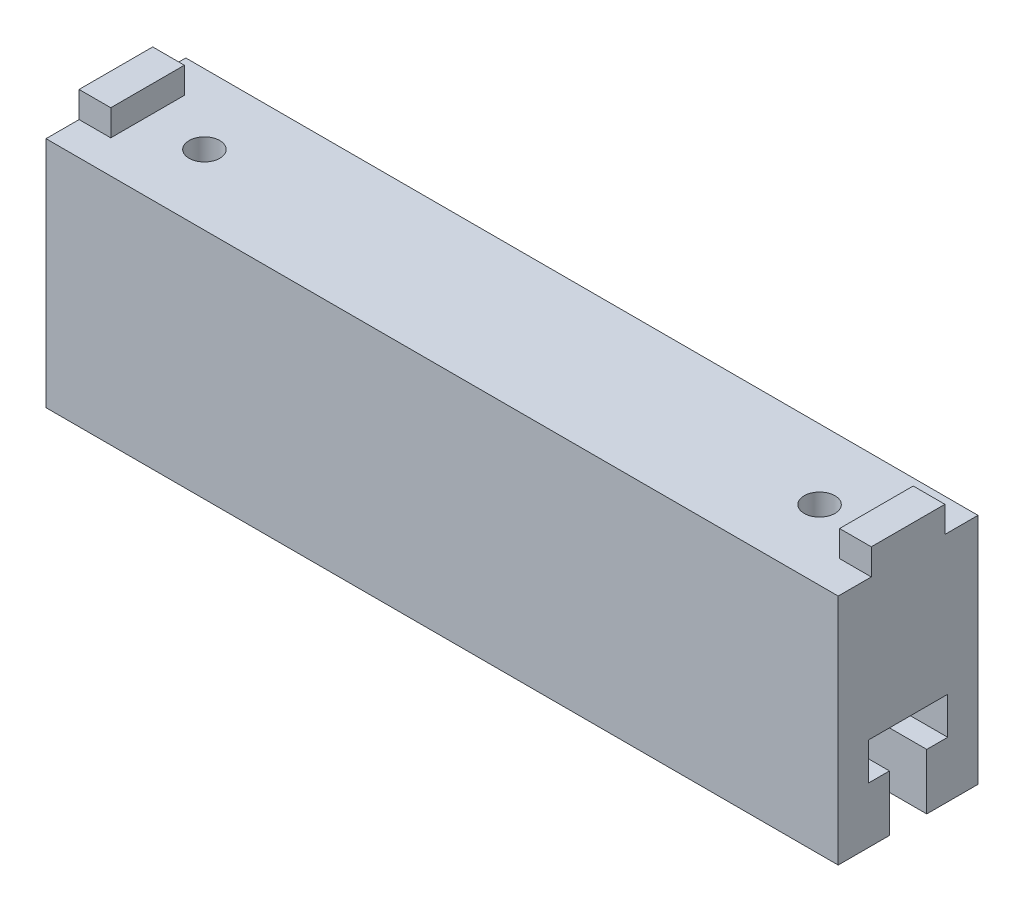
ISO-10303-21;
HEADER;
FILE_DESCRIPTION(('STEP AP214'),'2;1');
FILE_NAME('part.step','',(''),(''),'','','');
FILE_SCHEMA(('AUTOMOTIVE_DESIGN { 1 0 10303 214 1 1 1 1 }'));
ENDSEC;
DATA;
#1=APPLICATION_CONTEXT('core data for automotive mechanical design processes');
#2=APPLICATION_PROTOCOL_DEFINITION('international standard','automotive_design',2000,#1);
#3=PRODUCT_CONTEXT('',#1,'mechanical');
#4=PRODUCT('Part','Part','',(#3));
#5=PRODUCT_RELATED_PRODUCT_CATEGORY('part','',(#4));
#6=PRODUCT_DEFINITION_FORMATION('','',#4);
#7=PRODUCT_DEFINITION_CONTEXT('part definition',#1,'design');
#8=PRODUCT_DEFINITION('design','',#6,#7);
#9=PRODUCT_DEFINITION_SHAPE('','',#8);
#10=(LENGTH_UNIT() NAMED_UNIT(*) SI_UNIT(.MILLI.,.METRE.));
#11=(NAMED_UNIT(*) PLANE_ANGLE_UNIT() SI_UNIT($,.RADIAN.));
#12=(NAMED_UNIT(*) SI_UNIT($,.STERADIAN.) SOLID_ANGLE_UNIT());
#13=UNCERTAINTY_MEASURE_WITH_UNIT(LENGTH_MEASURE(1.E-05),#10,'distance_accuracy_value','');
#14=(GEOMETRIC_REPRESENTATION_CONTEXT(3) GLOBAL_UNCERTAINTY_ASSIGNED_CONTEXT((#13)) GLOBAL_UNIT_ASSIGNED_CONTEXT((#10,
#11,#12)) REPRESENTATION_CONTEXT('',''));
#15=CARTESIAN_POINT('',(0.,0.,0.));
#16=DIRECTION('',(0.,0.,1.));
#17=DIRECTION('',(1.,0.,0.));
#18=AXIS2_PLACEMENT_3D('',#15,#16,#17);
#19=CARTESIAN_POINT('',(0.,0.,0.));
#20=DIRECTION('',(0.,-1.,0.));
#21=DIRECTION('',(0.,0.,-1.));
#22=AXIS2_PLACEMENT_3D('',#19,#20,#21);
#23=PLANE('',#22);
#24=DIRECTION('',(1.,0.,0.));
#25=VECTOR('',#24,1.);
#26=CARTESIAN_POINT('',(-42.5,0.,2.));
#27=LINE('',#26,#25);
#28=CARTESIAN_POINT('',(-42.5,0.,2.));
#29=VERTEX_POINT('',#28);
#30=CARTESIAN_POINT('',(42.5,0.,2.));
#31=VERTEX_POINT('',#30);
#32=EDGE_CURVE('E178',#29,#31,#27,.T.);
#33=ORIENTED_EDGE('',*,*,#32,.T.);
#34=DIRECTION('',(0.,0.,-1.));
#35=VECTOR('',#34,1.);
#36=CARTESIAN_POINT('',(42.5,0.,7.5));
#37=LINE('',#36,#35);
#38=CARTESIAN_POINT('',(42.5,0.,7.5));
#39=VERTEX_POINT('',#38);
#40=EDGE_CURVE('E213',#39,#31,#37,.T.);
#41=ORIENTED_EDGE('',*,*,#40,.F.);
#42=DIRECTION('',(1.,0.,0.));
#43=VECTOR('',#42,1.);
#44=CARTESIAN_POINT('',(-42.5,0.,7.5));
#45=LINE('',#44,#43);
#46=CARTESIAN_POINT('',(-42.5,0.,7.5));
#47=VERTEX_POINT('',#46);
#48=EDGE_CURVE('E205',#47,#39,#45,.T.);
#49=ORIENTED_EDGE('',*,*,#48,.F.);
#50=DIRECTION('',(0.,0.,1.));
#51=VECTOR('',#50,1.);
#52=CARTESIAN_POINT('',(-42.5,0.,7.5));
#53=LINE('',#52,#51);
#54=EDGE_CURVE('E197',#29,#47,#53,.T.);
#55=ORIENTED_EDGE('',*,*,#54,.F.);
#56=EDGE_LOOP('',(#33,#41,#49,#55));
#57=FACE_BOUND('',#56,.T.);
#58=ADVANCED_FACE('F39',(#57),#23,.T.);
#59=CARTESIAN_POINT('',(0.,25.,0.));
#60=DIRECTION('',(0.,-1.,0.));
#61=DIRECTION('',(0.,0.,-1.));
#62=AXIS2_PLACEMENT_3D('',#59,#60,#61);
#63=PLANE('',#62);
#64=CARTESIAN_POINT('',(33.,25.,0.));
#65=DIRECTION('',(0.,1.,0.));
#66=DIRECTION('',(0.,0.,1.));
#67=AXIS2_PLACEMENT_3D('',#64,#65,#66);
#68=CIRCLE('',#67,1.651);
#69=CARTESIAN_POINT('',(33.,25.,1.651));
#70=VERTEX_POINT('',#69);
#71=EDGE_CURVE('E665',#70,#70,#68,.T.);
#72=ORIENTED_EDGE('',*,*,#71,.F.);
#73=EDGE_LOOP('',(#72));
#74=FACE_BOUND('',#73,.T.);
#75=CARTESIAN_POINT('',(-33.,25.,0.));
#76=DIRECTION('',(0.,1.,0.));
#77=DIRECTION('',(0.,0.,-1.));
#78=AXIS2_PLACEMENT_3D('',#75,#76,#77);
#79=CIRCLE('',#78,1.651);
#80=CARTESIAN_POINT('',(-33.,25.,1.651));
#81=VERTEX_POINT('',#80);
#82=EDGE_CURVE('E674',#81,#81,#79,.T.);
#83=ORIENTED_EDGE('',*,*,#82,.F.);
#84=EDGE_LOOP('',(#83));
#85=FACE_BOUND('',#84,.T.);
#86=DIRECTION('',(-1.,0.,0.));
#87=VECTOR('',#86,1.);
#88=CARTESIAN_POINT('',(42.5,25.,-3.95));
#89=LINE('',#88,#87);
#90=CARTESIAN_POINT('',(42.5,25.,-3.95));
#91=VERTEX_POINT('',#90);
#92=CARTESIAN_POINT('',(39.1,25.,-3.95000000000002));
#93=VERTEX_POINT('',#92);
#94=EDGE_CURVE('E277',#91,#93,#89,.T.);
#95=ORIENTED_EDGE('',*,*,#94,.F.);
#96=DIRECTION('',(0.,0.,-1.));
#97=VECTOR('',#96,1.);
#98=CARTESIAN_POINT('',(42.5,25.,7.5));
#99=LINE('',#98,#97);
#100=CARTESIAN_POINT('',(42.5,25.,-7.5));
#101=VERTEX_POINT('',#100);
#102=EDGE_CURVE('E219',#91,#101,#99,.T.);
#103=ORIENTED_EDGE('',*,*,#102,.T.);
#104=DIRECTION('',(-1.,0.,0.));
#105=VECTOR('',#104,1.);
#106=CARTESIAN_POINT('',(-42.5,25.,-7.5));
#107=LINE('',#106,#105);
#108=CARTESIAN_POINT('',(-42.5,25.,-7.5));
#109=VERTEX_POINT('',#108);
#110=EDGE_CURVE('E358',#101,#109,#107,.T.);
#111=ORIENTED_EDGE('',*,*,#110,.T.);
#112=DIRECTION('',(0.,0.,1.));
#113=VECTOR('',#112,1.);
#114=CARTESIAN_POINT('',(-42.5,25.,7.5));
#115=LINE('',#114,#113);
#116=CARTESIAN_POINT('',(-42.5,25.,-3.95));
#117=VERTEX_POINT('',#116);
#118=EDGE_CURVE('E233',#109,#117,#115,.T.);
#119=ORIENTED_EDGE('',*,*,#118,.T.);
#120=DIRECTION('',(-1.,0.,0.));
#121=VECTOR('',#120,1.);
#122=CARTESIAN_POINT('',(-42.5,25.,-3.95));
#123=LINE('',#122,#121);
#124=CARTESIAN_POINT('',(-39.1,25.,-3.95));
#125=VERTEX_POINT('',#124);
#126=EDGE_CURVE('E321',#125,#117,#123,.T.);
#127=ORIENTED_EDGE('',*,*,#126,.F.);
#128=DIRECTION('',(0.,0.,-1.));
#129=VECTOR('',#128,1.);
#130=CARTESIAN_POINT('',(-39.1,25.,3.95));
#131=LINE('',#130,#129);
#132=CARTESIAN_POINT('',(-39.1,25.,3.95));
#133=VERTEX_POINT('',#132);
#134=EDGE_CURVE('E334',#133,#125,#131,.T.);
#135=ORIENTED_EDGE('',*,*,#134,.F.);
#136=DIRECTION('',(1.,0.,0.));
#137=VECTOR('',#136,1.);
#138=CARTESIAN_POINT('',(-42.5,25.,3.95));
#139=LINE('',#138,#137);
#140=CARTESIAN_POINT('',(-42.5,25.,3.95));
#141=VERTEX_POINT('',#140);
#142=EDGE_CURVE('E315',#141,#133,#139,.T.);
#143=ORIENTED_EDGE('',*,*,#142,.F.);
#144=CARTESIAN_POINT('',(-42.5,25.,7.5));
#145=VERTEX_POINT('',#144);
#146=EDGE_CURVE('E361',#141,#145,#115,.T.);
#147=ORIENTED_EDGE('',*,*,#146,.T.);
#148=DIRECTION('',(1.,0.,0.));
#149=VECTOR('',#148,1.);
#150=CARTESIAN_POINT('',(-42.5,25.,7.5));
#151=LINE('',#150,#149);
#152=CARTESIAN_POINT('',(42.5,25.,7.5));
#153=VERTEX_POINT('',#152);
#154=EDGE_CURVE('E225',#145,#153,#151,.T.);
#155=ORIENTED_EDGE('',*,*,#154,.T.);
#156=CARTESIAN_POINT('',(42.5,25.,3.95));
#157=VERTEX_POINT('',#156);
#158=EDGE_CURVE('E355',#153,#157,#99,.T.);
#159=ORIENTED_EDGE('',*,*,#158,.T.);
#160=DIRECTION('',(1.,0.,0.));
#161=VECTOR('',#160,1.);
#162=CARTESIAN_POINT('',(42.5,25.,3.95));
#163=LINE('',#162,#161);
#164=CARTESIAN_POINT('',(39.1,25.,3.95));
#165=VERTEX_POINT('',#164);
#166=EDGE_CURVE('E283',#165,#157,#163,.T.);
#167=ORIENTED_EDGE('',*,*,#166,.F.);
#168=DIRECTION('',(0.,0.,1.));
#169=VECTOR('',#168,1.);
#170=CARTESIAN_POINT('',(39.1,25.,3.95));
#171=LINE('',#170,#169);
#172=EDGE_CURVE('E63',#93,#165,#171,.T.);
#173=ORIENTED_EDGE('',*,*,#172,.F.);
#174=EDGE_LOOP('',(#95,#103,#111,#119,#127,#135,#143,#147,#155,#159,#167,#173));
#175=FACE_BOUND('',#174,.T.);
#176=ADVANCED_FACE('F433',(#74,#85,#175),#63,.F.);
#177=CARTESIAN_POINT('',(42.5,25.,7.5));
#178=DIRECTION('',(-1.,0.,0.));
#179=DIRECTION('',(0.,0.,1.));
#180=AXIS2_PLACEMENT_3D('',#177,#178,#179);
#181=PLANE('',#180);
#182=ORIENTED_EDGE('',*,*,#40,.T.);
#183=DIRECTION('',(0.,1.,0.));
#184=VECTOR('',#183,1.);
#185=CARTESIAN_POINT('',(42.5,25.,2.00000000000001));
#186=LINE('',#185,#184);
#187=CARTESIAN_POINT('',(42.5,6.,2.));
#188=VERTEX_POINT('',#187);
#189=EDGE_CURVE('E185',#31,#188,#186,.T.);
#190=ORIENTED_EDGE('',*,*,#189,.T.);
#191=DIRECTION('',(0.,0.,1.));
#192=VECTOR('',#191,1.);
#193=CARTESIAN_POINT('',(42.5,6.,7.50000000000001));
#194=LINE('',#193,#192);
#195=CARTESIAN_POINT('',(42.5,6.,4.25));
#196=VERTEX_POINT('',#195);
#197=EDGE_CURVE('E273',#188,#196,#194,.T.);
#198=ORIENTED_EDGE('',*,*,#197,.T.);
#199=DIRECTION('',(0.,1.,0.));
#200=VECTOR('',#199,1.);
#201=CARTESIAN_POINT('',(42.5,25.,4.25));
#202=LINE('',#201,#200);
#203=CARTESIAN_POINT('',(42.5,10.,4.25));
#204=VERTEX_POINT('',#203);
#205=EDGE_CURVE('E269',#196,#204,#202,.T.);
#206=ORIENTED_EDGE('',*,*,#205,.T.);
#207=DIRECTION('',(0.,0.,-1.));
#208=VECTOR('',#207,1.);
#209=CARTESIAN_POINT('',(42.5,10.,7.5));
#210=LINE('',#209,#208);
#211=CARTESIAN_POINT('',(42.5,10.,-4.25));
#212=VERTEX_POINT('',#211);
#213=EDGE_CURVE('E265',#204,#212,#210,.T.);
#214=ORIENTED_EDGE('',*,*,#213,.T.);
#215=DIRECTION('',(0.,-1.,0.));
#216=VECTOR('',#215,1.);
#217=CARTESIAN_POINT('',(42.5,25.,-4.24999999999999));
#218=LINE('',#217,#216);
#219=CARTESIAN_POINT('',(42.5,6.,-4.25));
#220=VERTEX_POINT('',#219);
#221=EDGE_CURVE('E261',#212,#220,#218,.T.);
#222=ORIENTED_EDGE('',*,*,#221,.T.);
#223=DIRECTION('',(0.,0.,1.));
#224=VECTOR('',#223,1.);
#225=CARTESIAN_POINT('',(42.5,5.99999999999999,7.49999999999999));
#226=LINE('',#225,#224);
#227=CARTESIAN_POINT('',(42.5,6.,-2.));
#228=VERTEX_POINT('',#227);
#229=EDGE_CURVE('E257',#220,#228,#226,.T.);
#230=ORIENTED_EDGE('',*,*,#229,.T.);
#231=DIRECTION('',(0.,-1.,0.));
#232=VECTOR('',#231,1.);
#233=CARTESIAN_POINT('',(42.5,25.,-2.));
#234=LINE('',#233,#232);
#235=CARTESIAN_POINT('',(42.5,0.,-2.));
#236=VERTEX_POINT('',#235);
#237=EDGE_CURVE('E251',#228,#236,#234,.T.);
#238=ORIENTED_EDGE('',*,*,#237,.T.);
#239=CARTESIAN_POINT('',(42.5,0.,-7.5));
#240=VERTEX_POINT('',#239);
#241=EDGE_CURVE('E240',#236,#240,#37,.T.);
#242=ORIENTED_EDGE('',*,*,#241,.T.);
#243=DIRECTION('',(0.,-1.,0.));
#244=VECTOR('',#243,1.);
#245=CARTESIAN_POINT('',(42.5,25.,-7.5));
#246=LINE('',#245,#244);
#247=EDGE_CURVE('E11',#101,#240,#246,.T.);
#248=ORIENTED_EDGE('',*,*,#247,.F.);
#249=ORIENTED_EDGE('',*,*,#102,.F.);
#250=DIRECTION('',(0.,-1.,0.));
#251=VECTOR('',#250,1.);
#252=CARTESIAN_POINT('',(42.5,27.8,-3.95));
#253=LINE('',#252,#251);
#254=CARTESIAN_POINT('',(42.5,27.8,-3.95));
#255=VERTEX_POINT('',#254);
#256=EDGE_CURVE('E311',#255,#91,#253,.T.);
#257=ORIENTED_EDGE('',*,*,#256,.F.);
#258=DIRECTION('',(0.,0.,-1.));
#259=VECTOR('',#258,1.);
#260=CARTESIAN_POINT('',(42.5,27.8,3.95));
#261=LINE('',#260,#259);
#262=CARTESIAN_POINT('',(42.5,27.8,3.95));
#263=VERTEX_POINT('',#262);
#264=EDGE_CURVE('E278',#263,#255,#261,.T.);
#265=ORIENTED_EDGE('',*,*,#264,.F.);
#266=DIRECTION('',(0.,-1.,0.));
#267=VECTOR('',#266,1.);
#268=CARTESIAN_POINT('',(42.5,27.8,3.95));
#269=LINE('',#268,#267);
#270=EDGE_CURVE('E292',#263,#157,#269,.T.);
#271=ORIENTED_EDGE('',*,*,#270,.T.);
#272=ORIENTED_EDGE('',*,*,#158,.F.);
#273=DIRECTION('',(0.,-1.,0.));
#274=VECTOR('',#273,1.);
#275=CARTESIAN_POINT('',(42.5,25.,7.5));
#276=LINE('',#275,#274);
#277=EDGE_CURVE('E220',#153,#39,#276,.T.);
#278=ORIENTED_EDGE('',*,*,#277,.T.);
#279=EDGE_LOOP('',(#182,#190,#198,#206,#214,#222,#230,#238,#242,#248,#249,#257,#265,#271,#272,#278));
#280=FACE_BOUND('',#279,.T.);
#281=ADVANCED_FACE('F41',(#280),#181,.F.);
#282=CARTESIAN_POINT('',(-42.5,25.,-7.5));
#283=DIRECTION('',(0.,0.,1.));
#284=DIRECTION('',(1.,0.,0.));
#285=AXIS2_PLACEMENT_3D('',#282,#283,#284);
#286=PLANE('',#285);
#287=DIRECTION('',(-1.,0.,0.));
#288=VECTOR('',#287,1.);
#289=CARTESIAN_POINT('',(-42.5,0.,-7.5));
#290=LINE('',#289,#288);
#291=CARTESIAN_POINT('',(-42.5,0.,-7.5));
#292=VERTEX_POINT('',#291);
#293=EDGE_CURVE('E208',#240,#292,#290,.T.);
#294=ORIENTED_EDGE('',*,*,#293,.T.);
#295=DIRECTION('',(0.,-1.,0.));
#296=VECTOR('',#295,1.);
#297=CARTESIAN_POINT('',(-42.5,25.,-7.5));
#298=LINE('',#297,#296);
#299=EDGE_CURVE('E48',#109,#292,#298,.T.);
#300=ORIENTED_EDGE('',*,*,#299,.F.);
#301=ORIENTED_EDGE('',*,*,#110,.F.);
#302=ORIENTED_EDGE('',*,*,#247,.T.);
#303=EDGE_LOOP('',(#294,#300,#301,#302));
#304=FACE_BOUND('',#303,.T.);
#305=ADVANCED_FACE('F455',(#304),#286,.F.);
#306=CARTESIAN_POINT('',(-42.5,25.,7.5));
#307=DIRECTION('',(1.,0.,0.));
#308=DIRECTION('',(0.,0.,-1.));
#309=AXIS2_PLACEMENT_3D('',#306,#307,#308);
#310=PLANE('',#309);
#311=DIRECTION('',(0.,0.,-1.));
#312=VECTOR('',#311,1.);
#313=CARTESIAN_POINT('',(-42.5,6.,4.25));
#314=LINE('',#313,#312);
#315=CARTESIAN_POINT('',(-42.5,6.,4.25));
#316=VERTEX_POINT('',#315);
#317=CARTESIAN_POINT('',(-42.5,6.,2.));
#318=VERTEX_POINT('',#317);
#319=EDGE_CURVE('E192',#316,#318,#314,.T.);
#320=ORIENTED_EDGE('',*,*,#319,.T.);
#321=DIRECTION('',(0.,-1.,0.));
#322=VECTOR('',#321,1.);
#323=CARTESIAN_POINT('',(-42.5,0.,2.));
#324=LINE('',#323,#322);
#325=EDGE_CURVE('E182',#318,#29,#324,.T.);
#326=ORIENTED_EDGE('',*,*,#325,.T.);
#327=ORIENTED_EDGE('',*,*,#54,.T.);
#328=DIRECTION('',(0.,-1.,0.));
#329=VECTOR('',#328,1.);
#330=CARTESIAN_POINT('',(-42.5,25.,7.5));
#331=LINE('',#330,#329);
#332=EDGE_CURVE('E224',#145,#47,#331,.T.);
#333=ORIENTED_EDGE('',*,*,#332,.F.);
#334=ORIENTED_EDGE('',*,*,#146,.F.);
#335=DIRECTION('',(0.,-1.,0.));
#336=VECTOR('',#335,1.);
#337=CARTESIAN_POINT('',(-42.5,27.8,3.95));
#338=LINE('',#337,#336);
#339=CARTESIAN_POINT('',(-42.5,27.8,3.95));
#340=VERTEX_POINT('',#339);
#341=EDGE_CURVE('E351',#340,#141,#338,.T.);
#342=ORIENTED_EDGE('',*,*,#341,.F.);
#343=DIRECTION('',(0.,0.,1.));
#344=VECTOR('',#343,1.);
#345=CARTESIAN_POINT('',(-42.5,27.8,3.95));
#346=LINE('',#345,#344);
#347=CARTESIAN_POINT('',(-42.5,27.8,-3.95));
#348=VERTEX_POINT('',#347);
#349=EDGE_CURVE('E316',#348,#340,#346,.T.);
#350=ORIENTED_EDGE('',*,*,#349,.F.);
#351=DIRECTION('',(0.,-1.,0.));
#352=VECTOR('',#351,1.);
#353=CARTESIAN_POINT('',(-42.5,27.8,-3.95));
#354=LINE('',#353,#352);
#355=EDGE_CURVE('E330',#348,#117,#354,.T.);
#356=ORIENTED_EDGE('',*,*,#355,.T.);
#357=ORIENTED_EDGE('',*,*,#118,.F.);
#358=ORIENTED_EDGE('',*,*,#299,.T.);
#359=CARTESIAN_POINT('',(-42.5,0.,-2.));
#360=VERTEX_POINT('',#359);
#361=EDGE_CURVE('E207',#292,#360,#53,.T.);
#362=ORIENTED_EDGE('',*,*,#361,.T.);
#363=DIRECTION('',(0.,1.,0.));
#364=VECTOR('',#363,1.);
#365=CARTESIAN_POINT('',(-42.5,0.,-2.));
#366=LINE('',#365,#364);
#367=CARTESIAN_POINT('',(-42.5,6.,-2.));
#368=VERTEX_POINT('',#367);
#369=EDGE_CURVE('E55',#360,#368,#366,.T.);
#370=ORIENTED_EDGE('',*,*,#369,.T.);
#371=DIRECTION('',(0.,0.,-1.));
#372=VECTOR('',#371,1.);
#373=CARTESIAN_POINT('',(-42.5,6.,-2.));
#374=LINE('',#373,#372);
#375=CARTESIAN_POINT('',(-42.5,6.,-4.25));
#376=VERTEX_POINT('',#375);
#377=EDGE_CURVE('E375',#368,#376,#374,.T.);
#378=ORIENTED_EDGE('',*,*,#377,.T.);
#379=DIRECTION('',(0.,1.,0.));
#380=VECTOR('',#379,1.);
#381=CARTESIAN_POINT('',(-42.5,10.,-4.25));
#382=LINE('',#381,#380);
#383=CARTESIAN_POINT('',(-42.5,10.,-4.25));
#384=VERTEX_POINT('',#383);
#385=EDGE_CURVE('E379',#376,#384,#382,.T.);
#386=ORIENTED_EDGE('',*,*,#385,.T.);
#387=DIRECTION('',(0.,0.,1.));
#388=VECTOR('',#387,1.);
#389=CARTESIAN_POINT('',(-42.5,10.,4.25));
#390=LINE('',#389,#388);
#391=CARTESIAN_POINT('',(-42.5,10.,4.25));
#392=VERTEX_POINT('',#391);
#393=EDGE_CURVE('E387',#384,#392,#390,.T.);
#394=ORIENTED_EDGE('',*,*,#393,.T.);
#395=DIRECTION('',(0.,-1.,0.));
#396=VECTOR('',#395,1.);
#397=CARTESIAN_POINT('',(-42.5,10.,4.25));
#398=LINE('',#397,#396);
#399=EDGE_CURVE('E391',#392,#316,#398,.T.);
#400=ORIENTED_EDGE('',*,*,#399,.T.);
#401=EDGE_LOOP('',(#320,#326,#327,#333,#334,#342,#350,#356,#357,#358,#362,#370,#378,#386,#394,#400));
#402=FACE_BOUND('',#401,.T.);
#403=ADVANCED_FACE('F195',(#402),#310,.F.);
#404=CARTESIAN_POINT('',(-42.5,25.,7.5));
#405=DIRECTION('',(0.,0.,-1.));
#406=DIRECTION('',(-1.,0.,0.));
#407=AXIS2_PLACEMENT_3D('',#404,#405,#406);
#408=PLANE('',#407);
#409=ORIENTED_EDGE('',*,*,#48,.T.);
#410=ORIENTED_EDGE('',*,*,#277,.F.);
#411=ORIENTED_EDGE('',*,*,#154,.F.);
#412=ORIENTED_EDGE('',*,*,#332,.T.);
#413=EDGE_LOOP('',(#409,#410,#411,#412));
#414=FACE_BOUND('',#413,.T.);
#415=ADVANCED_FACE('F443',(#414),#408,.F.);
#416=DIRECTION('',(1.,0.,0.));
#417=VECTOR('',#416,1.);
#418=CARTESIAN_POINT('',(-42.5,0.,-2.));
#419=LINE('',#418,#417);
#420=EDGE_CURVE('E191',#360,#236,#419,.T.);
#421=ORIENTED_EDGE('',*,*,#420,.F.);
#422=ORIENTED_EDGE('',*,*,#361,.F.);
#423=ORIENTED_EDGE('',*,*,#293,.F.);
#424=ORIENTED_EDGE('',*,*,#241,.F.);
#425=EDGE_LOOP('',(#421,#422,#423,#424));
#426=FACE_BOUND('',#425,.T.);
#427=ADVANCED_FACE('F238',(#426),#23,.T.);
#428=CARTESIAN_POINT('',(-42.5,27.8,3.95));
#429=DIRECTION('',(0.,0.,-1.));
#430=DIRECTION('',(-1.,0.,0.));
#431=AXIS2_PLACEMENT_3D('',#428,#429,#430);
#432=PLANE('',#431);
#433=ORIENTED_EDGE('',*,*,#142,.T.);
#434=DIRECTION('',(0.,-1.,0.));
#435=VECTOR('',#434,1.);
#436=CARTESIAN_POINT('',(-39.1,27.8,3.95));
#437=LINE('',#436,#435);
#438=CARTESIAN_POINT('',(-39.1,27.8,3.95));
#439=VERTEX_POINT('',#438);
#440=EDGE_CURVE('E347',#439,#133,#437,.T.);
#441=ORIENTED_EDGE('',*,*,#440,.F.);
#442=DIRECTION('',(1.,0.,0.));
#443=VECTOR('',#442,1.);
#444=CARTESIAN_POINT('',(-42.5,27.8,3.95));
#445=LINE('',#444,#443);
#446=EDGE_CURVE('E320',#340,#439,#445,.T.);
#447=ORIENTED_EDGE('',*,*,#446,.F.);
#448=ORIENTED_EDGE('',*,*,#341,.T.);
#449=EDGE_LOOP('',(#433,#441,#447,#448));
#450=FACE_BOUND('',#449,.T.);
#451=ADVANCED_FACE('F442',(#450),#432,.F.);
#452=CARTESIAN_POINT('',(-39.1,27.8,3.95));
#453=DIRECTION('',(-1.,0.,0.));
#454=DIRECTION('',(0.,0.,1.));
#455=AXIS2_PLACEMENT_3D('',#452,#453,#454);
#456=PLANE('',#455);
#457=ORIENTED_EDGE('',*,*,#134,.T.);
#458=DIRECTION('',(0.,-1.,0.));
#459=VECTOR('',#458,1.);
#460=CARTESIAN_POINT('',(-39.1,27.8,-3.95));
#461=LINE('',#460,#459);
#462=CARTESIAN_POINT('',(-39.1,27.8,-3.95));
#463=VERTEX_POINT('',#462);
#464=EDGE_CURVE('E343',#463,#125,#461,.T.);
#465=ORIENTED_EDGE('',*,*,#464,.F.);
#466=DIRECTION('',(0.,0.,-1.));
#467=VECTOR('',#466,1.);
#468=CARTESIAN_POINT('',(-39.1,27.8,3.95));
#469=LINE('',#468,#467);
#470=EDGE_CURVE('E324',#439,#463,#469,.T.);
#471=ORIENTED_EDGE('',*,*,#470,.F.);
#472=ORIENTED_EDGE('',*,*,#440,.T.);
#473=EDGE_LOOP('',(#457,#465,#471,#472));
#474=FACE_BOUND('',#473,.T.);
#475=ADVANCED_FACE('F448',(#474),#456,.F.);
#476=CARTESIAN_POINT('',(-42.5,27.8,-3.95));
#477=DIRECTION('',(0.,0.,1.));
#478=DIRECTION('',(1.,0.,0.));
#479=AXIS2_PLACEMENT_3D('',#476,#477,#478);
#480=PLANE('',#479);
#481=ORIENTED_EDGE('',*,*,#126,.T.);
#482=ORIENTED_EDGE('',*,*,#355,.F.);
#483=DIRECTION('',(-1.,0.,0.));
#484=VECTOR('',#483,1.);
#485=CARTESIAN_POINT('',(-42.5,27.8,-3.95));
#486=LINE('',#485,#484);
#487=EDGE_CURVE('E327',#463,#348,#486,.T.);
#488=ORIENTED_EDGE('',*,*,#487,.F.);
#489=ORIENTED_EDGE('',*,*,#464,.T.);
#490=EDGE_LOOP('',(#481,#482,#488,#489));
#491=FACE_BOUND('',#490,.T.);
#492=ADVANCED_FACE('F488',(#491),#480,.F.);
#493=CARTESIAN_POINT('',(0.,27.8,0.));
#494=DIRECTION('',(0.,-1.,0.));
#495=DIRECTION('',(0.,0.,-1.));
#496=AXIS2_PLACEMENT_3D('',#493,#494,#495);
#497=PLANE('',#496);
#498=ORIENTED_EDGE('',*,*,#349,.T.);
#499=ORIENTED_EDGE('',*,*,#446,.T.);
#500=ORIENTED_EDGE('',*,*,#470,.T.);
#501=ORIENTED_EDGE('',*,*,#487,.T.);
#502=EDGE_LOOP('',(#498,#499,#500,#501));
#503=FACE_BOUND('',#502,.T.);
#504=ADVANCED_FACE('F481',(#503),#497,.F.);
#505=CARTESIAN_POINT('',(42.5,27.8,-3.95));
#506=DIRECTION('',(0.,0.,1.));
#507=DIRECTION('',(1.,0.,0.));
#508=AXIS2_PLACEMENT_3D('',#505,#506,#507);
#509=PLANE('',#508);
#510=ORIENTED_EDGE('',*,*,#94,.T.);
#511=DIRECTION('',(0.,-1.,0.));
#512=VECTOR('',#511,1.);
#513=CARTESIAN_POINT('',(39.1,27.8,-3.95000000000002));
#514=LINE('',#513,#512);
#515=CARTESIAN_POINT('',(39.1,27.8,-3.95000000000002));
#516=VERTEX_POINT('',#515);
#517=EDGE_CURVE('E307',#516,#93,#514,.T.);
#518=ORIENTED_EDGE('',*,*,#517,.F.);
#519=DIRECTION('',(-1.,0.,0.));
#520=VECTOR('',#519,1.);
#521=CARTESIAN_POINT('',(42.5,27.8,-3.95));
#522=LINE('',#521,#520);
#523=EDGE_CURVE('E282',#255,#516,#522,.T.);
#524=ORIENTED_EDGE('',*,*,#523,.F.);
#525=ORIENTED_EDGE('',*,*,#256,.T.);
#526=EDGE_LOOP('',(#510,#518,#524,#525));
#527=FACE_BOUND('',#526,.T.);
#528=ADVANCED_FACE('F479',(#527),#509,.F.);
#529=CARTESIAN_POINT('',(39.1,27.8,3.95));
#530=DIRECTION('',(1.,0.,0.));
#531=DIRECTION('',(0.,0.,-1.));
#532=AXIS2_PLACEMENT_3D('',#529,#530,#531);
#533=PLANE('',#532);
#534=ORIENTED_EDGE('',*,*,#172,.T.);
#535=DIRECTION('',(0.,-1.,0.));
#536=VECTOR('',#535,1.);
#537=CARTESIAN_POINT('',(39.1,27.8,3.95));
#538=LINE('',#537,#536);
#539=CARTESIAN_POINT('',(39.1,27.8,3.95));
#540=VERTEX_POINT('',#539);
#541=EDGE_CURVE('E303',#540,#165,#538,.T.);
#542=ORIENTED_EDGE('',*,*,#541,.F.);
#543=DIRECTION('',(0.,0.,1.));
#544=VECTOR('',#543,1.);
#545=CARTESIAN_POINT('',(39.1,27.8,3.95));
#546=LINE('',#545,#544);
#547=EDGE_CURVE('E286',#516,#540,#546,.T.);
#548=ORIENTED_EDGE('',*,*,#547,.F.);
#549=ORIENTED_EDGE('',*,*,#517,.T.);
#550=EDGE_LOOP('',(#534,#542,#548,#549));
#551=FACE_BOUND('',#550,.T.);
#552=ADVANCED_FACE('F476',(#551),#533,.F.);
#553=CARTESIAN_POINT('',(42.5,27.8,3.95));
#554=DIRECTION('',(0.,0.,-1.));
#555=DIRECTION('',(-1.,0.,0.));
#556=AXIS2_PLACEMENT_3D('',#553,#554,#555);
#557=PLANE('',#556);
#558=ORIENTED_EDGE('',*,*,#166,.T.);
#559=ORIENTED_EDGE('',*,*,#270,.F.);
#560=DIRECTION('',(1.,0.,0.));
#561=VECTOR('',#560,1.);
#562=CARTESIAN_POINT('',(42.5,27.8,3.95));
#563=LINE('',#562,#561);
#564=EDGE_CURVE('E289',#540,#263,#563,.T.);
#565=ORIENTED_EDGE('',*,*,#564,.F.);
#566=ORIENTED_EDGE('',*,*,#541,.T.);
#567=EDGE_LOOP('',(#558,#559,#565,#566));
#568=FACE_BOUND('',#567,.T.);
#569=ADVANCED_FACE('F428',(#568),#557,.F.);
#570=CARTESIAN_POINT('',(0.,27.8,0.));
#571=DIRECTION('',(0.,1.,0.));
#572=DIRECTION('',(0.,0.,1.));
#573=AXIS2_PLACEMENT_3D('',#570,#571,#572);
#574=PLANE('',#573);
#575=ORIENTED_EDGE('',*,*,#264,.T.);
#576=ORIENTED_EDGE('',*,*,#523,.T.);
#577=ORIENTED_EDGE('',*,*,#547,.T.);
#578=ORIENTED_EDGE('',*,*,#564,.T.);
#579=EDGE_LOOP('',(#575,#576,#577,#578));
#580=FACE_BOUND('',#579,.T.);
#581=ADVANCED_FACE('F421',(#580),#574,.T.);
#582=CARTESIAN_POINT('',(-42.5,6.,4.25));
#583=DIRECTION('',(0.,-1.,0.));
#584=DIRECTION('',(0.,0.,-1.));
#585=AXIS2_PLACEMENT_3D('',#582,#583,#584);
#586=PLANE('',#585);
#587=DIRECTION('',(1.,0.,0.));
#588=VECTOR('',#587,1.);
#589=CARTESIAN_POINT('',(-42.5,6.,2.));
#590=LINE('',#589,#588);
#591=EDGE_CURVE('E254',#318,#188,#590,.T.);
#592=ORIENTED_EDGE('',*,*,#591,.F.);
#593=ORIENTED_EDGE('',*,*,#319,.F.);
#594=DIRECTION('',(1.,0.,0.));
#595=VECTOR('',#594,1.);
#596=CARTESIAN_POINT('',(-42.5,6.,4.25));
#597=LINE('',#596,#595);
#598=EDGE_CURVE('E398',#316,#196,#597,.T.);
#599=ORIENTED_EDGE('',*,*,#598,.T.);
#600=ORIENTED_EDGE('',*,*,#197,.F.);
#601=EDGE_LOOP('',(#592,#593,#599,#600));
#602=FACE_BOUND('',#601,.T.);
#603=ADVANCED_FACE('F419',(#602),#586,.F.);
#604=CARTESIAN_POINT('',(-42.5,10.,4.25));
#605=DIRECTION('',(0.,0.,1.));
#606=DIRECTION('',(0.,-1.,0.));
#607=AXIS2_PLACEMENT_3D('',#604,#605,#606);
#608=PLANE('',#607);
#609=ORIENTED_EDGE('',*,*,#598,.F.);
#610=ORIENTED_EDGE('',*,*,#399,.F.);
#611=DIRECTION('',(1.,0.,0.));
#612=VECTOR('',#611,1.);
#613=CARTESIAN_POINT('',(-42.5,10.,4.25));
#614=LINE('',#613,#612);
#615=EDGE_CURVE('E402',#392,#204,#614,.T.);
#616=ORIENTED_EDGE('',*,*,#615,.T.);
#617=ORIENTED_EDGE('',*,*,#205,.F.);
#618=EDGE_LOOP('',(#609,#610,#616,#617));
#619=FACE_BOUND('',#618,.T.);
#620=ADVANCED_FACE('F417',(#619),#608,.F.);
#621=CARTESIAN_POINT('',(-42.5,10.,4.25));
#622=DIRECTION('',(0.,1.,0.));
#623=DIRECTION('',(0.,0.,1.));
#624=AXIS2_PLACEMENT_3D('',#621,#622,#623);
#625=PLANE('',#624);
#626=ORIENTED_EDGE('',*,*,#615,.F.);
#627=ORIENTED_EDGE('',*,*,#393,.F.);
#628=DIRECTION('',(1.,0.,0.));
#629=VECTOR('',#628,1.);
#630=CARTESIAN_POINT('',(-42.5,10.,-4.25));
#631=LINE('',#630,#629);
#632=EDGE_CURVE('E406',#384,#212,#631,.T.);
#633=ORIENTED_EDGE('',*,*,#632,.T.);
#634=ORIENTED_EDGE('',*,*,#213,.F.);
#635=EDGE_LOOP('',(#626,#627,#633,#634));
#636=FACE_BOUND('',#635,.T.);
#637=ADVANCED_FACE('F413',(#636),#625,.F.);
#638=CARTESIAN_POINT('',(-42.5,10.,-4.25));
#639=DIRECTION('',(0.,0.,-1.));
#640=DIRECTION('',(0.,1.,0.));
#641=AXIS2_PLACEMENT_3D('',#638,#639,#640);
#642=PLANE('',#641);
#643=ORIENTED_EDGE('',*,*,#632,.F.);
#644=ORIENTED_EDGE('',*,*,#385,.F.);
#645=DIRECTION('',(1.,0.,0.));
#646=VECTOR('',#645,1.);
#647=CARTESIAN_POINT('',(-42.5,6.,-4.25));
#648=LINE('',#647,#646);
#649=EDGE_CURVE('E247',#376,#220,#648,.T.);
#650=ORIENTED_EDGE('',*,*,#649,.T.);
#651=ORIENTED_EDGE('',*,*,#221,.F.);
#652=EDGE_LOOP('',(#643,#644,#650,#651));
#653=FACE_BOUND('',#652,.T.);
#654=ADVANCED_FACE('F411',(#653),#642,.F.);
#655=CARTESIAN_POINT('',(-42.5,6.,-2.));
#656=DIRECTION('',(0.,-1.,0.));
#657=DIRECTION('',(0.,0.,-1.));
#658=AXIS2_PLACEMENT_3D('',#655,#656,#657);
#659=PLANE('',#658);
#660=ORIENTED_EDGE('',*,*,#649,.F.);
#661=ORIENTED_EDGE('',*,*,#377,.F.);
#662=DIRECTION('',(1.,0.,0.));
#663=VECTOR('',#662,1.);
#664=CARTESIAN_POINT('',(-42.5,6.,-2.));
#665=LINE('',#664,#663);
#666=EDGE_CURVE('E243',#368,#228,#665,.T.);
#667=ORIENTED_EDGE('',*,*,#666,.T.);
#668=ORIENTED_EDGE('',*,*,#229,.F.);
#669=EDGE_LOOP('',(#660,#661,#667,#668));
#670=FACE_BOUND('',#669,.T.);
#671=ADVANCED_FACE('F372',(#670),#659,.F.);
#672=CARTESIAN_POINT('',(-42.5,0.,2.));
#673=DIRECTION('',(0.,0.,1.));
#674=DIRECTION('',(0.,-1.,0.));
#675=AXIS2_PLACEMENT_3D('',#672,#673,#674);
#676=PLANE('',#675);
#677=ORIENTED_EDGE('',*,*,#32,.F.);
#678=ORIENTED_EDGE('',*,*,#325,.F.);
#679=ORIENTED_EDGE('',*,*,#591,.T.);
#680=ORIENTED_EDGE('',*,*,#189,.F.);
#681=EDGE_LOOP('',(#677,#678,#679,#680));
#682=FACE_BOUND('',#681,.T.);
#683=ADVANCED_FACE('F180',(#682),#676,.F.);
#684=CARTESIAN_POINT('',(-42.5,0.,-2.));
#685=DIRECTION('',(0.,0.,-1.));
#686=DIRECTION('',(-1.,0.,0.));
#687=AXIS2_PLACEMENT_3D('',#684,#685,#686);
#688=PLANE('',#687);
#689=ORIENTED_EDGE('',*,*,#666,.F.);
#690=ORIENTED_EDGE('',*,*,#369,.F.);
#691=ORIENTED_EDGE('',*,*,#420,.T.);
#692=ORIENTED_EDGE('',*,*,#237,.F.);
#693=EDGE_LOOP('',(#689,#690,#691,#692));
#694=FACE_BOUND('',#693,.T.);
#695=ADVANCED_FACE('F369',(#694),#688,.F.);
#696=CARTESIAN_POINT('',(-33.,15.475,0.));
#697=DIRECTION('',(0.,1.,0.));
#698=DIRECTION('',(0.,0.,1.));
#699=AXIS2_PLACEMENT_3D('',#696,#697,#698);
#700=CYLINDRICAL_SURFACE('',#699,1.651);
#701=CARTESIAN_POINT('',(-33.,15.475,0.));
#702=DIRECTION('',(0.,1.,0.));
#703=DIRECTION('',(0.,0.,-1.));
#704=AXIS2_PLACEMENT_3D('',#701,#702,#703);
#705=CIRCLE('',#704,1.651);
#706=CARTESIAN_POINT('',(-33.,15.475,1.651));
#707=VERTEX_POINT('',#706);
#708=EDGE_CURVE('E669',#707,#707,#705,.T.);
#709=CARTESIAN_POINT('',(-33.,15.475,1.651));
#710=CARTESIAN_POINT('',(-33.,15.57421875,1.651));
#711=CARTESIAN_POINT('',(-33.,15.6734375,1.651));
#712=CARTESIAN_POINT('',(-33.,15.871875,1.651));
#713=CARTESIAN_POINT('',(-33.,15.97109375,1.651));
#714=CARTESIAN_POINT('',(-33.,16.16953125,1.651));
#715=CARTESIAN_POINT('',(-33.,16.26875,1.651));
#716=CARTESIAN_POINT('',(-33.,16.4671875,1.651));
#717=CARTESIAN_POINT('',(-33.,16.56640625,1.651));
#718=CARTESIAN_POINT('',(-33.,16.76484375,1.651));
#719=CARTESIAN_POINT('',(-33.,16.8640625,1.651));
#720=CARTESIAN_POINT('',(-33.,17.0625,1.651));
#721=CARTESIAN_POINT('',(-33.,17.16171875,1.651));
#722=CARTESIAN_POINT('',(-33.,17.36015625,1.651));
#723=CARTESIAN_POINT('',(-33.,17.459375,1.651));
#724=CARTESIAN_POINT('',(-33.,17.6578125,1.651));
#725=CARTESIAN_POINT('',(-33.,17.75703125,1.651));
#726=CARTESIAN_POINT('',(-33.,17.95546875,1.651));
#727=CARTESIAN_POINT('',(-33.,18.0546875,1.651));
#728=CARTESIAN_POINT('',(-33.,18.253125,1.651));
#729=CARTESIAN_POINT('',(-33.,18.35234375,1.651));
#730=CARTESIAN_POINT('',(-33.,18.55078125,1.651));
#731=CARTESIAN_POINT('',(-33.,18.65,1.651));
#732=CARTESIAN_POINT('',(-33.,18.8484375,1.651));
#733=CARTESIAN_POINT('',(-33.,18.94765625,1.651));
#734=CARTESIAN_POINT('',(-33.,19.14609375,1.651));
#735=CARTESIAN_POINT('',(-33.,19.2453125,1.651));
#736=CARTESIAN_POINT('',(-33.,19.44375,1.651));
#737=CARTESIAN_POINT('',(-33.,19.54296875,1.651));
#738=CARTESIAN_POINT('',(-33.,19.74140625,1.651));
#739=CARTESIAN_POINT('',(-33.,19.840625,1.651));
#740=CARTESIAN_POINT('',(-33.,20.0390625,1.651));
#741=CARTESIAN_POINT('',(-33.,20.13828125,1.651));
#742=CARTESIAN_POINT('',(-33.,20.33671875,1.651));
#743=CARTESIAN_POINT('',(-33.,20.4359375,1.651));
#744=CARTESIAN_POINT('',(-33.,20.634375,1.651));
#745=CARTESIAN_POINT('',(-33.,20.73359375,1.651));
#746=CARTESIAN_POINT('',(-33.,20.93203125,1.651));
#747=CARTESIAN_POINT('',(-33.,21.03125,1.651));
#748=CARTESIAN_POINT('',(-33.,21.2296875,1.651));
#749=CARTESIAN_POINT('',(-33.,21.32890625,1.651));
#750=CARTESIAN_POINT('',(-33.,21.52734375,1.651));
#751=CARTESIAN_POINT('',(-33.,21.6265625,1.651));
#752=CARTESIAN_POINT('',(-33.,21.825,1.651));
#753=CARTESIAN_POINT('',(-33.,21.92421875,1.651));
#754=CARTESIAN_POINT('',(-33.,22.12265625,1.651));
#755=CARTESIAN_POINT('',(-33.,22.221875,1.651));
#756=CARTESIAN_POINT('',(-33.,22.4203125,1.651));
#757=CARTESIAN_POINT('',(-33.,22.51953125,1.651));
#758=CARTESIAN_POINT('',(-33.,22.71796875,1.651));
#759=CARTESIAN_POINT('',(-33.,22.8171875,1.651));
#760=CARTESIAN_POINT('',(-33.,23.015625,1.651));
#761=CARTESIAN_POINT('',(-33.,23.11484375,1.651));
#762=CARTESIAN_POINT('',(-33.,23.31328125,1.651));
#763=CARTESIAN_POINT('',(-33.,23.4125,1.651));
#764=CARTESIAN_POINT('',(-33.,23.6109375,1.651));
#765=CARTESIAN_POINT('',(-33.,23.71015625,1.651));
#766=CARTESIAN_POINT('',(-33.,23.90859375,1.651));
#767=CARTESIAN_POINT('',(-33.,24.0078125,1.651));
#768=CARTESIAN_POINT('',(-33.,24.20625,1.651));
#769=CARTESIAN_POINT('',(-33.,24.30546875,1.651));
#770=CARTESIAN_POINT('',(-33.,24.50390625,1.651));
#771=CARTESIAN_POINT('',(-33.,24.603125,1.651));
#772=CARTESIAN_POINT('',(-33.,24.8015625,1.651));
#773=CARTESIAN_POINT('',(-33.,24.90078125,1.651));
#774=CARTESIAN_POINT('',(-33.,25.,1.651));
#775=B_SPLINE_CURVE_WITH_KNOTS('',3,(#709,#710,#711,#712,#713,#714,#715,#716,#717,#718,#719,
#720,#721,#722,#723,#724,#725,#726,#727,#728,#729,#730,#731,#732,#733,#734,#735,#736,#737,#738,
#739,#740,#741,#742,#743,#744,#745,#746,#747,#748,#749,#750,#751,#752,#753,#754,#755,#756,#757,
#758,#759,#760,#761,#762,#763,#764,#765,#766,#767,#768,#769,#770,#771,#772,#773,#774),
.UNSPECIFIED.,.F.,.F.,(4,2,2,2,2,2,2,2,2,2,2,2,2,2,2,2,2,2,2,2,2,2,2,2,2,2,2,2,2,2,2,2,4),(0.,
0.297656249999998,0.595312499999999,0.892968749999999,1.190625,1.48828125,1.7859375,2.08359375,
2.38125,2.67890625,2.9765625,3.27421875,3.571875,3.86953125,4.1671875,4.46484375,4.7625,
5.06015625,5.3578125,5.65546875,5.953125,6.25078125,6.5484375,6.84609375,7.14375,7.44140625,
7.7390625,8.03671875,8.334375,8.63203125,8.9296875,9.22734375,9.525),.UNSPECIFIED.);
#776=EDGE_CURVE('BSEAM615',#707,#81,#775,.T.);
#777=ORIENTED_EDGE('',*,*,#708,.F.);
#778=ORIENTED_EDGE('',*,*,#82,.T.);
#779=ORIENTED_EDGE('',*,*,#776,.T.);
#780=ORIENTED_EDGE('',*,*,#776,.F.);
#781=EDGE_LOOP('',(#777,#779,#778,#780));
#782=FACE_BOUND('',#781,.T.);
#783=ADVANCED_FACE('F615',(#782),#700,.F.);
#784=CARTESIAN_POINT('',(-33.,15.475,0.));
#785=DIRECTION('',(0.,-1.,0.));
#786=DIRECTION('',(0.,0.,-1.));
#787=AXIS2_PLACEMENT_3D('',#784,#785,#786);
#788=PLANE('',#787);
#789=ORIENTED_EDGE('',*,*,#708,.T.);
#790=EDGE_LOOP('',(#789));
#791=FACE_BOUND('',#790,.T.);
#792=ADVANCED_FACE('F629',(#791),#788,.F.);
#793=CARTESIAN_POINT('',(33.,15.475,0.));
#794=DIRECTION('',(0.,1.,0.));
#795=DIRECTION('',(0.,0.,1.));
#796=AXIS2_PLACEMENT_3D('',#793,#794,#795);
#797=CYLINDRICAL_SURFACE('',#796,1.651);
#798=CARTESIAN_POINT('',(33.,15.475,0.));
#799=DIRECTION('',(0.,1.,0.));
#800=DIRECTION('',(0.,0.,1.));
#801=AXIS2_PLACEMENT_3D('',#798,#799,#800);
#802=CIRCLE('',#801,1.651);
#803=CARTESIAN_POINT('',(33.,15.475,1.651));
#804=VERTEX_POINT('',#803);
#805=EDGE_CURVE('E202',#804,#804,#802,.T.);
#806=CARTESIAN_POINT('',(33.,15.475,1.651));
#807=CARTESIAN_POINT('',(33.,15.57421875,1.651));
#808=CARTESIAN_POINT('',(33.,15.6734375,1.651));
#809=CARTESIAN_POINT('',(33.,15.871875,1.651));
#810=CARTESIAN_POINT('',(33.,15.97109375,1.651));
#811=CARTESIAN_POINT('',(33.,16.16953125,1.651));
#812=CARTESIAN_POINT('',(33.,16.26875,1.651));
#813=CARTESIAN_POINT('',(33.,16.4671875,1.651));
#814=CARTESIAN_POINT('',(33.,16.56640625,1.651));
#815=CARTESIAN_POINT('',(33.,16.76484375,1.651));
#816=CARTESIAN_POINT('',(33.,16.8640625,1.651));
#817=CARTESIAN_POINT('',(33.,17.0625,1.651));
#818=CARTESIAN_POINT('',(33.,17.16171875,1.651));
#819=CARTESIAN_POINT('',(33.,17.36015625,1.651));
#820=CARTESIAN_POINT('',(33.,17.459375,1.651));
#821=CARTESIAN_POINT('',(33.,17.6578125,1.651));
#822=CARTESIAN_POINT('',(33.,17.75703125,1.651));
#823=CARTESIAN_POINT('',(33.,17.95546875,1.651));
#824=CARTESIAN_POINT('',(33.,18.0546875,1.651));
#825=CARTESIAN_POINT('',(33.,18.253125,1.651));
#826=CARTESIAN_POINT('',(33.,18.35234375,1.651));
#827=CARTESIAN_POINT('',(33.,18.55078125,1.651));
#828=CARTESIAN_POINT('',(33.,18.65,1.651));
#829=CARTESIAN_POINT('',(33.,18.8484375,1.651));
#830=CARTESIAN_POINT('',(33.,18.94765625,1.651));
#831=CARTESIAN_POINT('',(33.,19.14609375,1.651));
#832=CARTESIAN_POINT('',(33.,19.2453125,1.651));
#833=CARTESIAN_POINT('',(33.,19.44375,1.651));
#834=CARTESIAN_POINT('',(33.,19.54296875,1.651));
#835=CARTESIAN_POINT('',(33.,19.74140625,1.651));
#836=CARTESIAN_POINT('',(33.,19.840625,1.651));
#837=CARTESIAN_POINT('',(33.,20.0390625,1.651));
#838=CARTESIAN_POINT('',(33.,20.13828125,1.651));
#839=CARTESIAN_POINT('',(33.,20.33671875,1.651));
#840=CARTESIAN_POINT('',(33.,20.4359375,1.651));
#841=CARTESIAN_POINT('',(33.,20.634375,1.651));
#842=CARTESIAN_POINT('',(33.,20.73359375,1.651));
#843=CARTESIAN_POINT('',(33.,20.93203125,1.651));
#844=CARTESIAN_POINT('',(33.,21.03125,1.651));
#845=CARTESIAN_POINT('',(33.,21.2296875,1.651));
#846=CARTESIAN_POINT('',(33.,21.32890625,1.651));
#847=CARTESIAN_POINT('',(33.,21.52734375,1.651));
#848=CARTESIAN_POINT('',(33.,21.6265625,1.651));
#849=CARTESIAN_POINT('',(33.,21.825,1.651));
#850=CARTESIAN_POINT('',(33.,21.92421875,1.651));
#851=CARTESIAN_POINT('',(33.,22.12265625,1.651));
#852=CARTESIAN_POINT('',(33.,22.221875,1.651));
#853=CARTESIAN_POINT('',(33.,22.4203125,1.651));
#854=CARTESIAN_POINT('',(33.,22.51953125,1.651));
#855=CARTESIAN_POINT('',(33.,22.71796875,1.651));
#856=CARTESIAN_POINT('',(33.,22.8171875,1.651));
#857=CARTESIAN_POINT('',(33.,23.015625,1.651));
#858=CARTESIAN_POINT('',(33.,23.11484375,1.651));
#859=CARTESIAN_POINT('',(33.,23.31328125,1.651));
#860=CARTESIAN_POINT('',(33.,23.4125,1.651));
#861=CARTESIAN_POINT('',(33.,23.6109375,1.651));
#862=CARTESIAN_POINT('',(33.,23.71015625,1.651));
#863=CARTESIAN_POINT('',(33.,23.90859375,1.651));
#864=CARTESIAN_POINT('',(33.,24.0078125,1.651));
#865=CARTESIAN_POINT('',(33.,24.20625,1.651));
#866=CARTESIAN_POINT('',(33.,24.30546875,1.651));
#867=CARTESIAN_POINT('',(33.,24.50390625,1.651));
#868=CARTESIAN_POINT('',(33.,24.603125,1.651));
#869=CARTESIAN_POINT('',(33.,24.8015625,1.651));
#870=CARTESIAN_POINT('',(33.,24.90078125,1.651));
#871=CARTESIAN_POINT('',(33.,25.,1.651));
#872=B_SPLINE_CURVE_WITH_KNOTS('',3,(#806,#807,#808,#809,#810,#811,#812,#813,#814,#815,#816,
#817,#818,#819,#820,#821,#822,#823,#824,#825,#826,#827,#828,#829,#830,#831,#832,#833,#834,#835,
#836,#837,#838,#839,#840,#841,#842,#843,#844,#845,#846,#847,#848,#849,#850,#851,#852,#853,#854,
#855,#856,#857,#858,#859,#860,#861,#862,#863,#864,#865,#866,#867,#868,#869,#870,#871),
.UNSPECIFIED.,.F.,.F.,(4,2,2,2,2,2,2,2,2,2,2,2,2,2,2,2,2,2,2,2,2,2,2,2,2,2,2,2,2,2,2,2,4),(0.,
0.297656249999998,0.595312499999999,0.892968749999999,1.190625,1.48828125,1.7859375,2.08359375,
2.38125,2.67890625,2.9765625,3.27421875,3.571875,3.86953125,4.1671875,4.46484375,4.7625,
5.06015625,5.3578125,5.65546875,5.953125,6.25078125,6.5484375,6.84609375,7.14375,7.44140625,
7.7390625,8.03671875,8.334375,8.63203125,8.9296875,9.22734375,9.525),.UNSPECIFIED.);
#873=EDGE_CURVE('BSEAM638',#804,#70,#872,.T.);
#874=ORIENTED_EDGE('',*,*,#805,.F.);
#875=ORIENTED_EDGE('',*,*,#71,.T.);
#876=ORIENTED_EDGE('',*,*,#873,.T.);
#877=ORIENTED_EDGE('',*,*,#873,.F.);
#878=EDGE_LOOP('',(#874,#876,#875,#877));
#879=FACE_BOUND('',#878,.T.);
#880=ADVANCED_FACE('F638',(#879),#797,.F.);
#881=CARTESIAN_POINT('',(33.,15.475,0.));
#882=DIRECTION('',(0.,1.,0.));
#883=DIRECTION('',(0.,0.,1.));
#884=AXIS2_PLACEMENT_3D('',#881,#882,#883);
#885=PLANE('',#884);
#886=ORIENTED_EDGE('',*,*,#805,.T.);
#887=EDGE_LOOP('',(#886));
#888=FACE_BOUND('',#887,.T.);
#889=ADVANCED_FACE('F648',(#888),#885,.T.);
#890=CLOSED_SHELL('',(#58,#176,#281,#305,#403,#415,#427,#451,#475,#492,#504,#528,#552,#569,#581,
#603,#620,#637,#654,#671,#683,#695,#783,#792,#880,#889));
#891=MANIFOLD_SOLID_BREP('B2',#890);
#892=ADVANCED_BREP_SHAPE_REPRESENTATION('',(#18,#891),#14);
#893=SHAPE_DEFINITION_REPRESENTATION(#9,#892);
ENDSEC;
END-ISO-10303-21;
